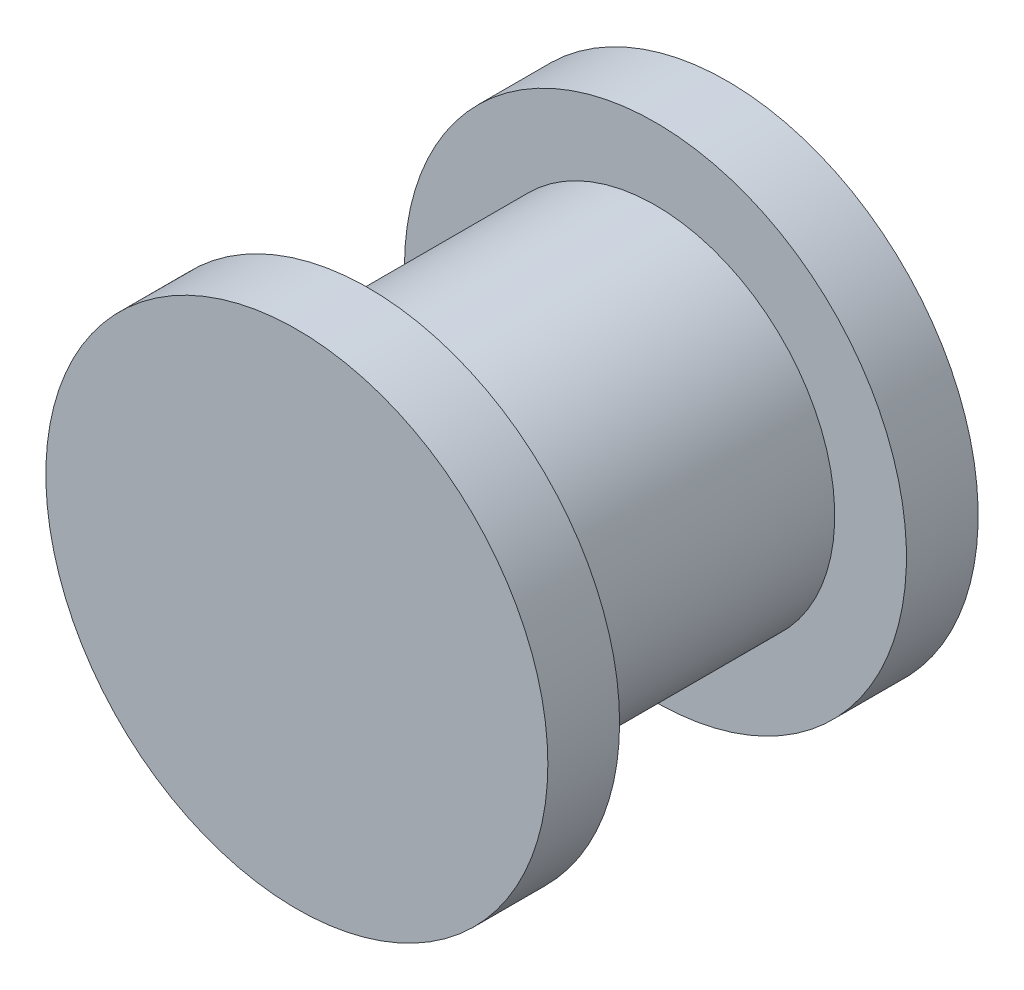
ISO-10303-21;
HEADER;
FILE_DESCRIPTION(('STEP AP214'),'2;1');
FILE_NAME('part.step','',(''),(''),'','','');
FILE_SCHEMA(('AUTOMOTIVE_DESIGN { 1 0 10303 214 1 1 1 1 }'));
ENDSEC;
DATA;
#1=APPLICATION_CONTEXT('core data for automotive mechanical design processes');
#2=APPLICATION_PROTOCOL_DEFINITION('international standard','automotive_design',2000,#1);
#3=PRODUCT_CONTEXT('',#1,'mechanical');
#4=PRODUCT('Part','Part','',(#3));
#5=PRODUCT_RELATED_PRODUCT_CATEGORY('part','',(#4));
#6=PRODUCT_DEFINITION_FORMATION('','',#4);
#7=PRODUCT_DEFINITION_CONTEXT('part definition',#1,'design');
#8=PRODUCT_DEFINITION('design','',#6,#7);
#9=PRODUCT_DEFINITION_SHAPE('','',#8);
#10=(LENGTH_UNIT() NAMED_UNIT(*) SI_UNIT(.MILLI.,.METRE.));
#11=(NAMED_UNIT(*) PLANE_ANGLE_UNIT() SI_UNIT($,.RADIAN.));
#12=(NAMED_UNIT(*) SI_UNIT($,.STERADIAN.) SOLID_ANGLE_UNIT());
#13=UNCERTAINTY_MEASURE_WITH_UNIT(LENGTH_MEASURE(1.E-05),#10,'distance_accuracy_value','');
#14=(GEOMETRIC_REPRESENTATION_CONTEXT(3) GLOBAL_UNCERTAINTY_ASSIGNED_CONTEXT((#13)) GLOBAL_UNIT_ASSIGNED_CONTEXT((#10,
#11,#12)) REPRESENTATION_CONTEXT('',''));
#15=CARTESIAN_POINT('',(0.,0.,0.));
#16=DIRECTION('',(0.,0.,1.));
#17=DIRECTION('',(1.,0.,0.));
#18=AXIS2_PLACEMENT_3D('',#15,#16,#17);
#19=CARTESIAN_POINT('',(0.,0.,20.));
#20=DIRECTION('',(0.,0.,-1.));
#21=DIRECTION('',(-1.,0.,0.));
#22=AXIS2_PLACEMENT_3D('',#19,#20,#21);
#23=CYLINDRICAL_SURFACE('',#22,12.5);
#24=CARTESIAN_POINT('',(0.,0.,20.));
#25=DIRECTION('',(0.,0.,1.));
#26=DIRECTION('',(1.,0.,0.));
#27=AXIS2_PLACEMENT_3D('',#24,#25,#26);
#28=CIRCLE('',#27,12.5);
#29=CARTESIAN_POINT('',(12.5,0.,20.));
#30=VERTEX_POINT('',#29);
#31=EDGE_CURVE('E10',#30,#30,#28,.T.);
#32=ORIENTED_EDGE('',*,*,#31,.F.);
#33=EDGE_LOOP('',(#32));
#34=FACE_BOUND('',#33,.T.);
#35=CARTESIAN_POINT('',(0.,0.,0.));
#36=DIRECTION('',(0.,0.,-1.));
#37=DIRECTION('',(-1.,0.,0.));
#38=AXIS2_PLACEMENT_3D('',#35,#36,#37);
#39=CIRCLE('',#38,12.5);
#40=CARTESIAN_POINT('',(-12.5,0.,0.));
#41=VERTEX_POINT('',#40);
#42=EDGE_CURVE('E46',#41,#41,#39,.T.);
#43=ORIENTED_EDGE('',*,*,#42,.F.);
#44=EDGE_LOOP('',(#43));
#45=FACE_BOUND('',#44,.T.);
#46=ADVANCED_FACE('F31',(#34,#45),#23,.T.);
#47=CARTESIAN_POINT('',(0.,0.,20.));
#48=DIRECTION('',(0.,0.,1.));
#49=DIRECTION('',(1.,0.,0.));
#50=AXIS2_PLACEMENT_3D('',#47,#48,#49);
#51=PLANE('',#50);
#52=CARTESIAN_POINT('',(0.,0.,20.));
#53=DIRECTION('',(0.,0.,1.));
#54=DIRECTION('',(1.,0.,0.));
#55=AXIS2_PLACEMENT_3D('',#52,#53,#54);
#56=CIRCLE('',#55,17.5);
#57=CARTESIAN_POINT('',(17.5,0.,20.));
#58=VERTEX_POINT('',#57);
#59=EDGE_CURVE('E41',#58,#58,#56,.T.);
#60=ORIENTED_EDGE('',*,*,#59,.F.);
#61=EDGE_LOOP('',(#60));
#62=FACE_BOUND('',#61,.T.);
#63=ORIENTED_EDGE('',*,*,#31,.T.);
#64=EDGE_LOOP('',(#63));
#65=FACE_BOUND('',#64,.T.);
#66=ADVANCED_FACE('F73',(#62,#65),#51,.F.);
#67=CARTESIAN_POINT('',(0.,0.,25.));
#68=DIRECTION('',(0.,0.,-1.));
#69=DIRECTION('',(-1.,0.,0.));
#70=AXIS2_PLACEMENT_3D('',#67,#68,#69);
#71=CYLINDRICAL_SURFACE('',#70,17.5);
#72=CARTESIAN_POINT('',(0.,0.,25.));
#73=DIRECTION('',(0.,0.,1.));
#74=DIRECTION('',(1.,0.,0.));
#75=AXIS2_PLACEMENT_3D('',#72,#73,#74);
#76=CIRCLE('',#75,17.5);
#77=CARTESIAN_POINT('',(17.5,0.,25.));
#78=VERTEX_POINT('',#77);
#79=EDGE_CURVE('E37',#78,#78,#76,.T.);
#80=ORIENTED_EDGE('',*,*,#79,.F.);
#81=EDGE_LOOP('',(#80));
#82=FACE_BOUND('',#81,.T.);
#83=ORIENTED_EDGE('',*,*,#59,.T.);
#84=EDGE_LOOP('',(#83));
#85=FACE_BOUND('',#84,.T.);
#86=ADVANCED_FACE('F78',(#82,#85),#71,.T.);
#87=CARTESIAN_POINT('',(0.,0.,25.));
#88=DIRECTION('',(0.,0.,1.));
#89=DIRECTION('',(1.,0.,0.));
#90=AXIS2_PLACEMENT_3D('',#87,#88,#89);
#91=PLANE('',#90);
#92=ORIENTED_EDGE('',*,*,#79,.T.);
#93=EDGE_LOOP('',(#92));
#94=FACE_BOUND('',#93,.T.);
#95=ADVANCED_FACE('F68',(#94),#91,.T.);
#96=CARTESIAN_POINT('',(0.,0.,0.));
#97=DIRECTION('',(0.,0.,-1.));
#98=DIRECTION('',(-1.,0.,0.));
#99=AXIS2_PLACEMENT_3D('',#96,#97,#98);
#100=PLANE('',#99);
#101=CARTESIAN_POINT('',(0.,0.,0.));
#102=DIRECTION('',(0.,0.,-1.));
#103=DIRECTION('',(-1.,0.,0.));
#104=AXIS2_PLACEMENT_3D('',#101,#102,#103);
#105=CIRCLE('',#104,17.5);
#106=CARTESIAN_POINT('',(-17.5,0.,0.));
#107=VERTEX_POINT('',#106);
#108=EDGE_CURVE('E51',#107,#107,#105,.T.);
#109=ORIENTED_EDGE('',*,*,#108,.F.);
#110=EDGE_LOOP('',(#109));
#111=FACE_BOUND('',#110,.T.);
#112=ORIENTED_EDGE('',*,*,#42,.T.);
#113=EDGE_LOOP('',(#112));
#114=FACE_BOUND('',#113,.T.);
#115=ADVANCED_FACE('F62',(#111,#114),#100,.F.);
#116=CARTESIAN_POINT('',(0.,0.,-5.));
#117=DIRECTION('',(0.,0.,1.));
#118=DIRECTION('',(1.,0.,0.));
#119=AXIS2_PLACEMENT_3D('',#116,#117,#118);
#120=CYLINDRICAL_SURFACE('',#119,17.5);
#121=CARTESIAN_POINT('',(0.,0.,-5.));
#122=DIRECTION('',(0.,0.,-1.));
#123=DIRECTION('',(-1.,0.,0.));
#124=AXIS2_PLACEMENT_3D('',#121,#122,#123);
#125=CIRCLE('',#124,17.5);
#126=CARTESIAN_POINT('',(-17.5,0.,-5.));
#127=VERTEX_POINT('',#126);
#128=EDGE_CURVE('E50',#127,#127,#125,.T.);
#129=ORIENTED_EDGE('',*,*,#128,.F.);
#130=EDGE_LOOP('',(#129));
#131=FACE_BOUND('',#130,.T.);
#132=ORIENTED_EDGE('',*,*,#108,.T.);
#133=EDGE_LOOP('',(#132));
#134=FACE_BOUND('',#133,.T.);
#135=ADVANCED_FACE('F59',(#131,#134),#120,.T.);
#136=CARTESIAN_POINT('',(0.,0.,-5.));
#137=DIRECTION('',(0.,0.,-1.));
#138=DIRECTION('',(-1.,0.,0.));
#139=AXIS2_PLACEMENT_3D('',#136,#137,#138);
#140=PLANE('',#139);
#141=ORIENTED_EDGE('',*,*,#128,.T.);
#142=EDGE_LOOP('',(#141));
#143=FACE_BOUND('',#142,.T.);
#144=ADVANCED_FACE('F57',(#143),#140,.T.);
#145=CLOSED_SHELL('',(#46,#66,#86,#95,#115,#135,#144));
#146=MANIFOLD_SOLID_BREP('B2',#145);
#147=ADVANCED_BREP_SHAPE_REPRESENTATION('',(#18,#146),#14);
#148=SHAPE_DEFINITION_REPRESENTATION(#9,#147);
ENDSEC;
END-ISO-10303-21;
